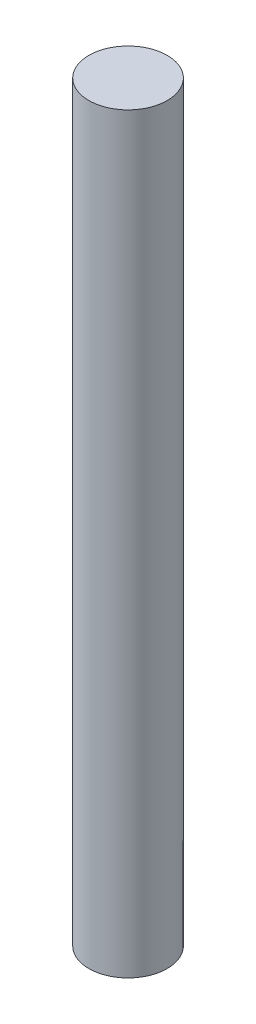
ISO-10303-21;
HEADER;
FILE_DESCRIPTION(('STEP AP214'),'2;1');
FILE_NAME('part.step','',(''),(''),'','','');
FILE_SCHEMA(('AUTOMOTIVE_DESIGN { 1 0 10303 214 1 1 1 1 }'));
ENDSEC;
DATA;
#1=APPLICATION_CONTEXT('core data for automotive mechanical design processes');
#2=APPLICATION_PROTOCOL_DEFINITION('international standard','automotive_design',2000,#1);
#3=PRODUCT_CONTEXT('',#1,'mechanical');
#4=PRODUCT('Part','Part','',(#3));
#5=PRODUCT_RELATED_PRODUCT_CATEGORY('part','',(#4));
#6=PRODUCT_DEFINITION_FORMATION('','',#4);
#7=PRODUCT_DEFINITION_CONTEXT('part definition',#1,'design');
#8=PRODUCT_DEFINITION('design','',#6,#7);
#9=PRODUCT_DEFINITION_SHAPE('','',#8);
#10=(LENGTH_UNIT() NAMED_UNIT(*) SI_UNIT(.MILLI.,.METRE.));
#11=(NAMED_UNIT(*) PLANE_ANGLE_UNIT() SI_UNIT($,.RADIAN.));
#12=(NAMED_UNIT(*) SI_UNIT($,.STERADIAN.) SOLID_ANGLE_UNIT());
#13=UNCERTAINTY_MEASURE_WITH_UNIT(LENGTH_MEASURE(1.E-05),#10,'distance_accuracy_value','');
#14=(GEOMETRIC_REPRESENTATION_CONTEXT(3) GLOBAL_UNCERTAINTY_ASSIGNED_CONTEXT((#13)) GLOBAL_UNIT_ASSIGNED_CONTEXT((#10,
#11,#12)) REPRESENTATION_CONTEXT('',''));
#15=CARTESIAN_POINT('',(0.,0.,0.));
#16=DIRECTION('',(0.,0.,1.));
#17=DIRECTION('',(1.,0.,0.));
#18=AXIS2_PLACEMENT_3D('',#15,#16,#17);
#19=CARTESIAN_POINT('',(0.,76.2,0.));
#20=DIRECTION('',(0.,-1.,0.));
#21=DIRECTION('',(0.,0.,-1.));
#22=AXIS2_PLACEMENT_3D('',#19,#20,#21);
#23=CYLINDRICAL_SURFACE('',#22,3.96875);
#24=CARTESIAN_POINT('',(0.,76.2,0.));
#25=DIRECTION('',(0.,1.,0.));
#26=DIRECTION('',(0.,0.,1.));
#27=AXIS2_PLACEMENT_3D('',#24,#25,#26);
#28=CIRCLE('',#27,3.96875);
#29=CARTESIAN_POINT('',(0.,76.2,-3.96875));
#30=VERTEX_POINT('',#29);
#31=EDGE_CURVE('E13',#30,#30,#28,.T.);
#32=CARTESIAN_POINT('',(0.,0.,0.));
#33=DIRECTION('',(0.,1.,0.));
#34=DIRECTION('',(0.,0.,1.));
#35=AXIS2_PLACEMENT_3D('',#32,#33,#34);
#36=CIRCLE('',#35,3.96875);
#37=CARTESIAN_POINT('',(0.,0.,-3.96875));
#38=VERTEX_POINT('',#37);
#39=EDGE_CURVE('E54',#38,#38,#36,.T.);
#40=CARTESIAN_POINT('',(0.,76.2,-3.96875));
#41=CARTESIAN_POINT('',(0.,75.40625,-3.96875));
#42=CARTESIAN_POINT('',(0.,74.6125,-3.96875));
#43=CARTESIAN_POINT('',(0.,73.025,-3.96875));
#44=CARTESIAN_POINT('',(0.,72.23125,-3.96875));
#45=CARTESIAN_POINT('',(0.,70.64375,-3.96875));
#46=CARTESIAN_POINT('',(0.,69.85,-3.96875));
#47=CARTESIAN_POINT('',(0.,68.2625,-3.96875));
#48=CARTESIAN_POINT('',(0.,67.46875,-3.96875));
#49=CARTESIAN_POINT('',(0.,65.88125,-3.96875));
#50=CARTESIAN_POINT('',(0.,65.0875,-3.96875));
#51=CARTESIAN_POINT('',(0.,63.5,-3.96875));
#52=CARTESIAN_POINT('',(0.,62.70625,-3.96875));
#53=CARTESIAN_POINT('',(0.,61.11875,-3.96875));
#54=CARTESIAN_POINT('',(0.,60.325,-3.96875));
#55=CARTESIAN_POINT('',(0.,58.7375,-3.96875));
#56=CARTESIAN_POINT('',(0.,57.94375,-3.96875));
#57=CARTESIAN_POINT('',(0.,56.35625,-3.96875));
#58=CARTESIAN_POINT('',(0.,55.5625,-3.96875));
#59=CARTESIAN_POINT('',(0.,53.975,-3.96875));
#60=CARTESIAN_POINT('',(0.,53.18125,-3.96875));
#61=CARTESIAN_POINT('',(0.,51.59375,-3.96875));
#62=CARTESIAN_POINT('',(0.,50.8,-3.96875));
#63=CARTESIAN_POINT('',(0.,49.2125,-3.96875));
#64=CARTESIAN_POINT('',(0.,48.41875,-3.96875));
#65=CARTESIAN_POINT('',(0.,46.83125,-3.96875));
#66=CARTESIAN_POINT('',(0.,46.0375,-3.96875));
#67=CARTESIAN_POINT('',(0.,44.45,-3.96875));
#68=CARTESIAN_POINT('',(0.,43.65625,-3.96875));
#69=CARTESIAN_POINT('',(0.,42.06875,-3.96875));
#70=CARTESIAN_POINT('',(0.,41.275,-3.96875));
#71=CARTESIAN_POINT('',(0.,39.6875,-3.96875));
#72=CARTESIAN_POINT('',(0.,38.89375,-3.96875));
#73=CARTESIAN_POINT('',(0.,37.30625,-3.96875));
#74=CARTESIAN_POINT('',(0.,36.5125,-3.96875));
#75=CARTESIAN_POINT('',(0.,34.925,-3.96875));
#76=CARTESIAN_POINT('',(0.,34.13125,-3.96875));
#77=CARTESIAN_POINT('',(0.,32.54375,-3.96875));
#78=CARTESIAN_POINT('',(0.,31.75,-3.96875));
#79=CARTESIAN_POINT('',(0.,30.1625,-3.96875));
#80=CARTESIAN_POINT('',(0.,29.36875,-3.96875));
#81=CARTESIAN_POINT('',(0.,27.78125,-3.96875));
#82=CARTESIAN_POINT('',(0.,26.9875,-3.96875));
#83=CARTESIAN_POINT('',(0.,25.4,-3.96875));
#84=CARTESIAN_POINT('',(0.,24.60625,-3.96875));
#85=CARTESIAN_POINT('',(0.,23.01875,-3.96875));
#86=CARTESIAN_POINT('',(0.,22.225,-3.96875));
#87=CARTESIAN_POINT('',(0.,20.6375,-3.96875));
#88=CARTESIAN_POINT('',(0.,19.84375,-3.96875));
#89=CARTESIAN_POINT('',(0.,18.25625,-3.96875));
#90=CARTESIAN_POINT('',(0.,17.4625,-3.96875));
#91=CARTESIAN_POINT('',(0.,15.875,-3.96875));
#92=CARTESIAN_POINT('',(0.,15.08125,-3.96875));
#93=CARTESIAN_POINT('',(0.,13.49375,-3.96875));
#94=CARTESIAN_POINT('',(0.,12.7,-3.96875));
#95=CARTESIAN_POINT('',(0.,11.1125,-3.96875));
#96=CARTESIAN_POINT('',(0.,10.31875,-3.96875));
#97=CARTESIAN_POINT('',(0.,8.73125,-3.96875));
#98=CARTESIAN_POINT('',(0.,7.93750000000001,-3.96875));
#99=CARTESIAN_POINT('',(0.,6.35,-3.96875));
#100=CARTESIAN_POINT('',(0.,5.55625,-3.96875));
#101=CARTESIAN_POINT('',(0.,3.96875,-3.96875));
#102=CARTESIAN_POINT('',(0.,3.175,-3.96875));
#103=CARTESIAN_POINT('',(0.,1.5875,-3.96875));
#104=CARTESIAN_POINT('',(0.,0.793750000000001,-3.96875));
#105=CARTESIAN_POINT('',(0.,0.,-3.96875));
#106=B_SPLINE_CURVE_WITH_KNOTS('',3,(#40,#41,#42,#43,#44,#45,#46,#47,#48,#49,#50,#51,#52,#53,
#54,#55,#56,#57,#58,#59,#60,#61,#62,#63,#64,#65,#66,#67,#68,#69,#70,#71,#72,#73,#74,#75,#76,#77,
#78,#79,#80,#81,#82,#83,#84,#85,#86,#87,#88,#89,#90,#91,#92,#93,#94,#95,#96,#97,#98,#99,#100,
#101,#102,#103,#104,#105),.UNSPECIFIED.,.F.,.F.,(4,2,2,2,2,2,2,2,2,2,2,2,2,2,2,2,2,2,2,2,2,2,2,
2,2,2,2,2,2,2,2,2,4),(0.,2.38125,4.7625,7.14375,9.52500000000001,11.90625,14.2875,16.66875,
19.05,21.43125,23.8125,26.19375,28.575,30.95625,33.3375,35.71875,38.1,40.48125,42.8625,45.24375,
47.625,50.00625,52.3875,54.76875,57.15,59.53125,61.9125,64.29375,66.675,69.05625,71.4375,
73.81875,76.2),.UNSPECIFIED.);
#107=EDGE_CURVE('BSEAM51',#30,#38,#106,.T.);
#108=ORIENTED_EDGE('',*,*,#31,.F.);
#109=ORIENTED_EDGE('',*,*,#39,.T.);
#110=ORIENTED_EDGE('',*,*,#107,.T.);
#111=ORIENTED_EDGE('',*,*,#107,.F.);
#112=EDGE_LOOP('',(#108,#110,#109,#111));
#113=FACE_BOUND('',#112,.T.);
#114=ADVANCED_FACE('F51',(#113),#23,.T.);
#115=CARTESIAN_POINT('',(0.,76.2,0.));
#116=DIRECTION('',(0.,1.,0.));
#117=DIRECTION('',(0.,0.,1.));
#118=AXIS2_PLACEMENT_3D('',#115,#116,#117);
#119=PLANE('',#118);
#120=ORIENTED_EDGE('',*,*,#31,.T.);
#121=EDGE_LOOP('',(#120));
#122=FACE_BOUND('',#121,.T.);
#123=ADVANCED_FACE('F80',(#122),#119,.T.);
#124=CARTESIAN_POINT('',(0.,0.,0.));
#125=DIRECTION('',(0.,1.,0.));
#126=DIRECTION('',(0.,0.,1.));
#127=AXIS2_PLACEMENT_3D('',#124,#125,#126);
#128=PLANE('',#127);
#129=CARTESIAN_POINT('',(0.,0.,0.));
#130=DIRECTION('',(0.,-1.,0.));
#131=DIRECTION('',(0.,0.,-1.));
#132=AXIS2_PLACEMENT_3D('',#129,#130,#131);
#133=CIRCLE('',#132,2.01929999999999);
#134=CARTESIAN_POINT('',(0.,0.,-2.01929999999999));
#135=VERTEX_POINT('',#134);
#136=EDGE_CURVE('E70',#135,#135,#133,.T.);
#137=ORIENTED_EDGE('',*,*,#136,.F.);
#138=EDGE_LOOP('',(#137));
#139=FACE_BOUND('',#138,.T.);
#140=ORIENTED_EDGE('',*,*,#39,.F.);
#141=EDGE_LOOP('',(#140));
#142=FACE_BOUND('',#141,.T.);
#143=ADVANCED_FACE('F64',(#139,#142),#128,.F.);
#144=CARTESIAN_POINT('',(0.,12.7,0.));
#145=DIRECTION('',(0.,-1.,0.));
#146=DIRECTION('',(0.,0.,-1.));
#147=AXIS2_PLACEMENT_3D('',#144,#145,#146);
#148=CONICAL_SURFACE('',#147,2.0193,1.02974425867665);
#149=CARTESIAN_POINT('',(0.,13.9133178480024,0.));
#150=VERTEX_POINT('',#149);
#151=VERTEX_LOOP('',#150);
#152=FACE_BOUND('',#151,.T.);
#153=CARTESIAN_POINT('',(0.,12.7,0.));
#154=DIRECTION('',(0.,-1.,0.));
#155=DIRECTION('',(0.,0.,-1.));
#156=AXIS2_PLACEMENT_3D('',#153,#154,#155);
#157=CIRCLE('',#156,2.0193);
#158=CARTESIAN_POINT('',(0.,12.7,-2.0193));
#159=VERTEX_POINT('',#158);
#160=EDGE_CURVE('E68',#159,#159,#157,.T.);
#161=ORIENTED_EDGE('',*,*,#160,.T.);
#162=EDGE_LOOP('',(#161));
#163=FACE_BOUND('',#162,.T.);
#164=ADVANCED_FACE('F60',(#152,#163),#148,.F.);
#165=CARTESIAN_POINT('',(0.,0.,0.));
#166=DIRECTION('',(0.,-1.,0.));
#167=DIRECTION('',(0.,0.,-1.));
#168=AXIS2_PLACEMENT_3D('',#165,#166,#167);
#169=CYLINDRICAL_SURFACE('',#168,2.01929999999999);
#170=ORIENTED_EDGE('',*,*,#160,.F.);
#171=EDGE_LOOP('',(#170));
#172=FACE_BOUND('',#171,.T.);
#173=ORIENTED_EDGE('',*,*,#136,.T.);
#174=EDGE_LOOP('',(#173));
#175=FACE_BOUND('',#174,.T.);
#176=ADVANCED_FACE('F63',(#172,#175),#169,.F.);
#177=CLOSED_SHELL('',(#114,#123,#143,#164,#176));
#178=MANIFOLD_SOLID_BREP('B2',#177);
#179=ADVANCED_BREP_SHAPE_REPRESENTATION('',(#18,#178),#14);
#180=SHAPE_DEFINITION_REPRESENTATION(#9,#179);
ENDSEC;
END-ISO-10303-21;
